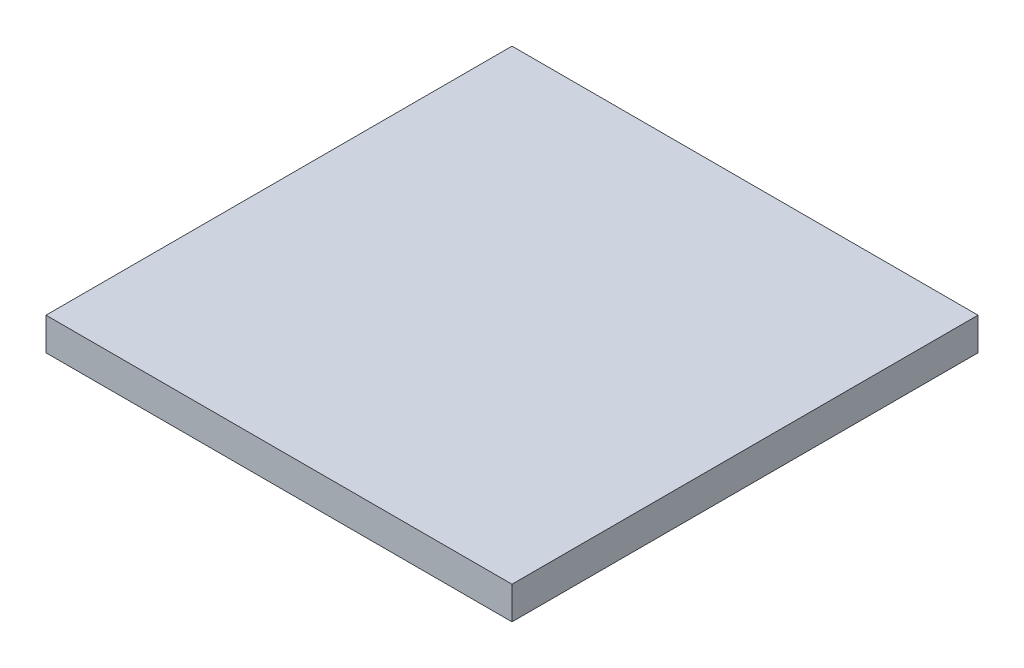
ISO-10303-21;
HEADER;
FILE_DESCRIPTION(('STEP AP214'),'2;1');
FILE_NAME('part.step','',(''),(''),'','','');
FILE_SCHEMA(('AUTOMOTIVE_DESIGN { 1 0 10303 214 1 1 1 1 }'));
ENDSEC;
DATA;
#1=APPLICATION_CONTEXT('core data for automotive mechanical design processes');
#2=APPLICATION_PROTOCOL_DEFINITION('international standard','automotive_design',2000,#1);
#3=PRODUCT_CONTEXT('',#1,'mechanical');
#4=PRODUCT('Part','Part','',(#3));
#5=PRODUCT_RELATED_PRODUCT_CATEGORY('part','',(#4));
#6=PRODUCT_DEFINITION_FORMATION('','',#4);
#7=PRODUCT_DEFINITION_CONTEXT('part definition',#1,'design');
#8=PRODUCT_DEFINITION('design','',#6,#7);
#9=PRODUCT_DEFINITION_SHAPE('','',#8);
#10=(LENGTH_UNIT() NAMED_UNIT(*) SI_UNIT(.MILLI.,.METRE.));
#11=(NAMED_UNIT(*) PLANE_ANGLE_UNIT() SI_UNIT($,.RADIAN.));
#12=(NAMED_UNIT(*) SI_UNIT($,.STERADIAN.) SOLID_ANGLE_UNIT());
#13=UNCERTAINTY_MEASURE_WITH_UNIT(LENGTH_MEASURE(1.E-05),#10,'distance_accuracy_value','');
#14=(GEOMETRIC_REPRESENTATION_CONTEXT(3) GLOBAL_UNCERTAINTY_ASSIGNED_CONTEXT((#13)) GLOBAL_UNIT_ASSIGNED_CONTEXT((#10,
#11,#12)) REPRESENTATION_CONTEXT('',''));
#15=CARTESIAN_POINT('',(0.,0.,0.));
#16=DIRECTION('',(0.,0.,1.));
#17=DIRECTION('',(1.,0.,0.));
#18=AXIS2_PLACEMENT_3D('',#15,#16,#17);
#19=CARTESIAN_POINT('',(63.5,15.24,63.5));
#20=DIRECTION('',(-1.,0.,0.));
#21=DIRECTION('',(0.,0.,1.));
#22=AXIS2_PLACEMENT_3D('',#19,#20,#21);
#23=PLANE('',#22);
#24=DIRECTION('',(0.,-1.,0.));
#25=VECTOR('',#24,1.);
#26=CARTESIAN_POINT('',(63.5,15.24,63.5));
#27=LINE('',#26,#25);
#28=CARTESIAN_POINT('',(63.5,15.24,63.5));
#29=VERTEX_POINT('',#28);
#30=CARTESIAN_POINT('',(63.5,6.35,63.5));
#31=VERTEX_POINT('',#30);
#32=EDGE_CURVE('E186',#29,#31,#27,.T.);
#33=ORIENTED_EDGE('',*,*,#32,.T.);
#34=DIRECTION('',(0.,0.,1.));
#35=VECTOR('',#34,1.);
#36=CARTESIAN_POINT('',(63.5,6.35,-63.5));
#37=LINE('',#36,#35);
#38=CARTESIAN_POINT('',(63.5,6.35,-63.5));
#39=VERTEX_POINT('',#38);
#40=EDGE_CURVE('E60',#39,#31,#37,.T.);
#41=ORIENTED_EDGE('',*,*,#40,.F.);
#42=DIRECTION('',(0.,-1.,0.));
#43=VECTOR('',#42,1.);
#44=CARTESIAN_POINT('',(63.5,15.24,-63.5));
#45=LINE('',#44,#43);
#46=CARTESIAN_POINT('',(63.5,15.24,-63.5));
#47=VERTEX_POINT('',#46);
#48=EDGE_CURVE('E11',#47,#39,#45,.T.);
#49=ORIENTED_EDGE('',*,*,#48,.F.);
#50=DIRECTION('',(0.,0.,-1.));
#51=VECTOR('',#50,1.);
#52=CARTESIAN_POINT('',(63.5,15.24,63.5));
#53=LINE('',#52,#51);
#54=EDGE_CURVE('E173',#29,#47,#53,.T.);
#55=ORIENTED_EDGE('',*,*,#54,.F.);
#56=EDGE_LOOP('',(#33,#41,#49,#55));
#57=FACE_BOUND('',#56,.T.);
#58=ADVANCED_FACE('F45',(#57),#23,.F.);
#59=CARTESIAN_POINT('',(-63.5,15.24,-63.5));
#60=DIRECTION('',(0.,0.,1.));
#61=DIRECTION('',(1.,0.,0.));
#62=AXIS2_PLACEMENT_3D('',#59,#60,#61);
#63=PLANE('',#62);
#64=ORIENTED_EDGE('',*,*,#48,.T.);
#65=DIRECTION('',(1.,0.,0.));
#66=VECTOR('',#65,1.);
#67=CARTESIAN_POINT('',(-63.5,6.35,-63.5));
#68=LINE('',#67,#66);
#69=CARTESIAN_POINT('',(-63.5,6.35,-63.5));
#70=VERTEX_POINT('',#69);
#71=EDGE_CURVE('E170',#70,#39,#68,.T.);
#72=ORIENTED_EDGE('',*,*,#71,.F.);
#73=DIRECTION('',(0.,-1.,0.));
#74=VECTOR('',#73,1.);
#75=CARTESIAN_POINT('',(-63.5,15.24,-63.5));
#76=LINE('',#75,#74);
#77=CARTESIAN_POINT('',(-63.5,15.24,-63.5));
#78=VERTEX_POINT('',#77);
#79=EDGE_CURVE('E53',#78,#70,#76,.T.);
#80=ORIENTED_EDGE('',*,*,#79,.F.);
#81=DIRECTION('',(-1.,0.,0.));
#82=VECTOR('',#81,1.);
#83=CARTESIAN_POINT('',(-63.5,15.24,-63.5));
#84=LINE('',#83,#82);
#85=EDGE_CURVE('E177',#47,#78,#84,.T.);
#86=ORIENTED_EDGE('',*,*,#85,.F.);
#87=EDGE_LOOP('',(#64,#72,#80,#86));
#88=FACE_BOUND('',#87,.T.);
#89=ADVANCED_FACE('F203',(#88),#63,.F.);
#90=CARTESIAN_POINT('',(-63.5,15.24,63.5));
#91=DIRECTION('',(1.,0.,0.));
#92=DIRECTION('',(0.,0.,-1.));
#93=AXIS2_PLACEMENT_3D('',#90,#91,#92);
#94=PLANE('',#93);
#95=ORIENTED_EDGE('',*,*,#79,.T.);
#96=DIRECTION('',(0.,0.,-1.));
#97=VECTOR('',#96,1.);
#98=CARTESIAN_POINT('',(-63.5,6.35,-63.5));
#99=LINE('',#98,#97);
#100=CARTESIAN_POINT('',(-63.5,6.35,63.5));
#101=VERTEX_POINT('',#100);
#102=EDGE_CURVE('E167',#101,#70,#99,.T.);
#103=ORIENTED_EDGE('',*,*,#102,.F.);
#104=DIRECTION('',(0.,-1.,0.));
#105=VECTOR('',#104,1.);
#106=CARTESIAN_POINT('',(-63.5,15.24,63.5));
#107=LINE('',#106,#105);
#108=CARTESIAN_POINT('',(-63.5,15.24,63.5));
#109=VERTEX_POINT('',#108);
#110=EDGE_CURVE('E190',#109,#101,#107,.T.);
#111=ORIENTED_EDGE('',*,*,#110,.F.);
#112=DIRECTION('',(0.,0.,1.));
#113=VECTOR('',#112,1.);
#114=CARTESIAN_POINT('',(-63.5,15.24,63.5));
#115=LINE('',#114,#113);
#116=EDGE_CURVE('E180',#78,#109,#115,.T.);
#117=ORIENTED_EDGE('',*,*,#116,.F.);
#118=EDGE_LOOP('',(#95,#103,#111,#117));
#119=FACE_BOUND('',#118,.T.);
#120=ADVANCED_FACE('F199',(#119),#94,.F.);
#121=CARTESIAN_POINT('',(-63.5,15.24,63.5));
#122=DIRECTION('',(0.,0.,-1.));
#123=DIRECTION('',(-1.,0.,0.));
#124=AXIS2_PLACEMENT_3D('',#121,#122,#123);
#125=PLANE('',#124);
#126=ORIENTED_EDGE('',*,*,#110,.T.);
#127=DIRECTION('',(-1.,0.,0.));
#128=VECTOR('',#127,1.);
#129=CARTESIAN_POINT('',(-63.5,6.35,63.5));
#130=LINE('',#129,#128);
#131=EDGE_CURVE('E164',#31,#101,#130,.T.);
#132=ORIENTED_EDGE('',*,*,#131,.F.);
#133=ORIENTED_EDGE('',*,*,#32,.F.);
#134=DIRECTION('',(1.,0.,0.));
#135=VECTOR('',#134,1.);
#136=CARTESIAN_POINT('',(-63.5,15.24,63.5));
#137=LINE('',#136,#135);
#138=EDGE_CURVE('E183',#109,#29,#137,.T.);
#139=ORIENTED_EDGE('',*,*,#138,.F.);
#140=EDGE_LOOP('',(#126,#132,#133,#139));
#141=FACE_BOUND('',#140,.T.);
#142=ADVANCED_FACE('F210',(#141),#125,.F.);
#143=CARTESIAN_POINT('',(0.,15.24,0.));
#144=DIRECTION('',(0.,-1.,0.));
#145=DIRECTION('',(0.,0.,-1.));
#146=AXIS2_PLACEMENT_3D('',#143,#144,#145);
#147=PLANE('',#146);
#148=ORIENTED_EDGE('',*,*,#54,.T.);
#149=ORIENTED_EDGE('',*,*,#85,.T.);
#150=ORIENTED_EDGE('',*,*,#116,.T.);
#151=ORIENTED_EDGE('',*,*,#138,.T.);
#152=EDGE_LOOP('',(#148,#149,#150,#151));
#153=FACE_BOUND('',#152,.T.);
#154=ADVANCED_FACE('F212',(#153),#147,.F.);
#155=CARTESIAN_POINT('',(0.,6.35,0.));
#156=DIRECTION('',(0.,1.,0.));
#157=DIRECTION('',(0.,0.,1.));
#158=AXIS2_PLACEMENT_3D('',#155,#156,#157);
#159=PLANE('',#158);
#160=DIRECTION('',(1.,0.,0.));
#161=VECTOR('',#160,1.);
#162=CARTESIAN_POINT('',(-50.165,6.35,-50.165));
#163=LINE('',#162,#161);
#164=CARTESIAN_POINT('',(-50.165,6.35,-50.165));
#165=VERTEX_POINT('',#164);
#166=CARTESIAN_POINT('',(50.165,6.35,-50.165));
#167=VERTEX_POINT('',#166);
#168=EDGE_CURVE('E129',#165,#167,#163,.T.);
#169=ORIENTED_EDGE('',*,*,#168,.F.);
#170=DIRECTION('',(0.,0.,-1.));
#171=VECTOR('',#170,1.);
#172=CARTESIAN_POINT('',(-50.165,6.35,50.165));
#173=LINE('',#172,#171);
#174=CARTESIAN_POINT('',(-50.165,6.35,50.165));
#175=VERTEX_POINT('',#174);
#176=EDGE_CURVE('E123',#175,#165,#173,.T.);
#177=ORIENTED_EDGE('',*,*,#176,.F.);
#178=DIRECTION('',(-1.,0.,0.));
#179=VECTOR('',#178,1.);
#180=CARTESIAN_POINT('',(50.165,6.35,50.165));
#181=LINE('',#180,#179);
#182=CARTESIAN_POINT('',(50.165,6.35,50.165));
#183=VERTEX_POINT('',#182);
#184=EDGE_CURVE('E132',#183,#175,#181,.T.);
#185=ORIENTED_EDGE('',*,*,#184,.F.);
#186=DIRECTION('',(0.,0.,1.));
#187=VECTOR('',#186,1.);
#188=CARTESIAN_POINT('',(50.165,6.35,-50.165));
#189=LINE('',#188,#187);
#190=EDGE_CURVE('E114',#167,#183,#189,.T.);
#191=ORIENTED_EDGE('',*,*,#190,.F.);
#192=EDGE_LOOP('',(#169,#177,#185,#191));
#193=FACE_BOUND('',#192,.T.);
#194=ORIENTED_EDGE('',*,*,#40,.T.);
#195=ORIENTED_EDGE('',*,*,#131,.T.);
#196=ORIENTED_EDGE('',*,*,#102,.T.);
#197=ORIENTED_EDGE('',*,*,#71,.T.);
#198=EDGE_LOOP('',(#194,#195,#196,#197));
#199=FACE_BOUND('',#198,.T.);
#200=ADVANCED_FACE('F127',(#193,#199),#159,.F.);
#201=CARTESIAN_POINT('',(-50.165,6.35,-50.165));
#202=DIRECTION('',(0.,0.,-1.));
#203=DIRECTION('',(-1.,0.,0.));
#204=AXIS2_PLACEMENT_3D('',#201,#202,#203);
#205=PLANE('',#204);
#206=DIRECTION('',(1.,0.,0.));
#207=VECTOR('',#206,1.);
#208=CARTESIAN_POINT('',(-50.165,0.,-50.165));
#209=LINE('',#208,#207);
#210=CARTESIAN_POINT('',(-50.165,0.,-50.165));
#211=VERTEX_POINT('',#210);
#212=CARTESIAN_POINT('',(50.165,0.,-50.165));
#213=VERTEX_POINT('',#212);
#214=EDGE_CURVE('E148',#211,#213,#209,.T.);
#215=ORIENTED_EDGE('',*,*,#214,.F.);
#216=DIRECTION('',(0.,-1.,0.));
#217=VECTOR('',#216,1.);
#218=CARTESIAN_POINT('',(-50.165,6.35,-50.165));
#219=LINE('',#218,#217);
#220=EDGE_CURVE('E136',#165,#211,#219,.T.);
#221=ORIENTED_EDGE('',*,*,#220,.F.);
#222=ORIENTED_EDGE('',*,*,#168,.T.);
#223=DIRECTION('',(0.,-1.,0.));
#224=VECTOR('',#223,1.);
#225=CARTESIAN_POINT('',(50.165,6.35,-50.165));
#226=LINE('',#225,#224);
#227=EDGE_CURVE('E111',#167,#213,#226,.T.);
#228=ORIENTED_EDGE('',*,*,#227,.T.);
#229=EDGE_LOOP('',(#215,#221,#222,#228));
#230=FACE_BOUND('',#229,.T.);
#231=ADVANCED_FACE('F135',(#230),#205,.T.);
#232=CARTESIAN_POINT('',(-50.165,6.35,50.165));
#233=DIRECTION('',(-1.,0.,0.));
#234=DIRECTION('',(0.,0.,1.));
#235=AXIS2_PLACEMENT_3D('',#232,#233,#234);
#236=PLANE('',#235);
#237=DIRECTION('',(0.,0.,-1.));
#238=VECTOR('',#237,1.);
#239=CARTESIAN_POINT('',(-50.165,0.,50.165));
#240=LINE('',#239,#238);
#241=CARTESIAN_POINT('',(-50.165,0.,50.165));
#242=VERTEX_POINT('',#241);
#243=EDGE_CURVE('E138',#242,#211,#240,.T.);
#244=ORIENTED_EDGE('',*,*,#243,.F.);
#245=DIRECTION('',(0.,-1.,0.));
#246=VECTOR('',#245,1.);
#247=CARTESIAN_POINT('',(-50.165,6.35,50.165));
#248=LINE('',#247,#246);
#249=EDGE_CURVE('E157',#175,#242,#248,.T.);
#250=ORIENTED_EDGE('',*,*,#249,.F.);
#251=ORIENTED_EDGE('',*,*,#176,.T.);
#252=ORIENTED_EDGE('',*,*,#220,.T.);
#253=EDGE_LOOP('',(#244,#250,#251,#252));
#254=FACE_BOUND('',#253,.T.);
#255=ADVANCED_FACE('F240',(#254),#236,.T.);
#256=CARTESIAN_POINT('',(50.165,6.35,50.165));
#257=DIRECTION('',(0.,0.,1.));
#258=DIRECTION('',(1.,0.,0.));
#259=AXIS2_PLACEMENT_3D('',#256,#257,#258);
#260=PLANE('',#259);
#261=DIRECTION('',(-1.,0.,0.));
#262=VECTOR('',#261,1.);
#263=CARTESIAN_POINT('',(50.165,0.,50.165));
#264=LINE('',#263,#262);
#265=CARTESIAN_POINT('',(50.165,0.,50.165));
#266=VERTEX_POINT('',#265);
#267=EDGE_CURVE('E68',#266,#242,#264,.T.);
#268=ORIENTED_EDGE('',*,*,#267,.F.);
#269=DIRECTION('',(0.,-1.,0.));
#270=VECTOR('',#269,1.);
#271=CARTESIAN_POINT('',(50.165,6.35,50.165));
#272=LINE('',#271,#270);
#273=EDGE_CURVE('E122',#183,#266,#272,.T.);
#274=ORIENTED_EDGE('',*,*,#273,.F.);
#275=ORIENTED_EDGE('',*,*,#184,.T.);
#276=ORIENTED_EDGE('',*,*,#249,.T.);
#277=EDGE_LOOP('',(#268,#274,#275,#276));
#278=FACE_BOUND('',#277,.T.);
#279=ADVANCED_FACE('F236',(#278),#260,.T.);
#280=CARTESIAN_POINT('',(50.165,6.35,-50.165));
#281=DIRECTION('',(1.,0.,0.));
#282=DIRECTION('',(0.,0.,-1.));
#283=AXIS2_PLACEMENT_3D('',#280,#281,#282);
#284=PLANE('',#283);
#285=DIRECTION('',(0.,0.,1.));
#286=VECTOR('',#285,1.);
#287=CARTESIAN_POINT('',(50.165,0.,-50.165));
#288=LINE('',#287,#286);
#289=EDGE_CURVE('E116',#213,#266,#288,.T.);
#290=ORIENTED_EDGE('',*,*,#289,.F.);
#291=ORIENTED_EDGE('',*,*,#227,.F.);
#292=ORIENTED_EDGE('',*,*,#190,.T.);
#293=ORIENTED_EDGE('',*,*,#273,.T.);
#294=EDGE_LOOP('',(#290,#291,#292,#293));
#295=FACE_BOUND('',#294,.T.);
#296=ADVANCED_FACE('F113',(#295),#284,.T.);
#297=CARTESIAN_POINT('',(0.,0.,0.));
#298=DIRECTION('',(0.,-1.,0.));
#299=DIRECTION('',(0.,0.,-1.));
#300=AXIS2_PLACEMENT_3D('',#297,#298,#299);
#301=PLANE('',#300);
#302=ORIENTED_EDGE('',*,*,#243,.T.);
#303=ORIENTED_EDGE('',*,*,#214,.T.);
#304=ORIENTED_EDGE('',*,*,#289,.T.);
#305=ORIENTED_EDGE('',*,*,#267,.T.);
#306=EDGE_LOOP('',(#302,#303,#304,#305));
#307=FACE_BOUND('',#306,.T.);
#308=ADVANCED_FACE('F230',(#307),#301,.T.);
#309=CLOSED_SHELL('',(#58,#89,#120,#142,#154,#200,#231,#255,#279,#296,#308));
#310=MANIFOLD_SOLID_BREP('B2',#309);
#311=ADVANCED_BREP_SHAPE_REPRESENTATION('',(#18,#310),#14);
#312=SHAPE_DEFINITION_REPRESENTATION(#9,#311);
ENDSEC;
END-ISO-10303-21;
